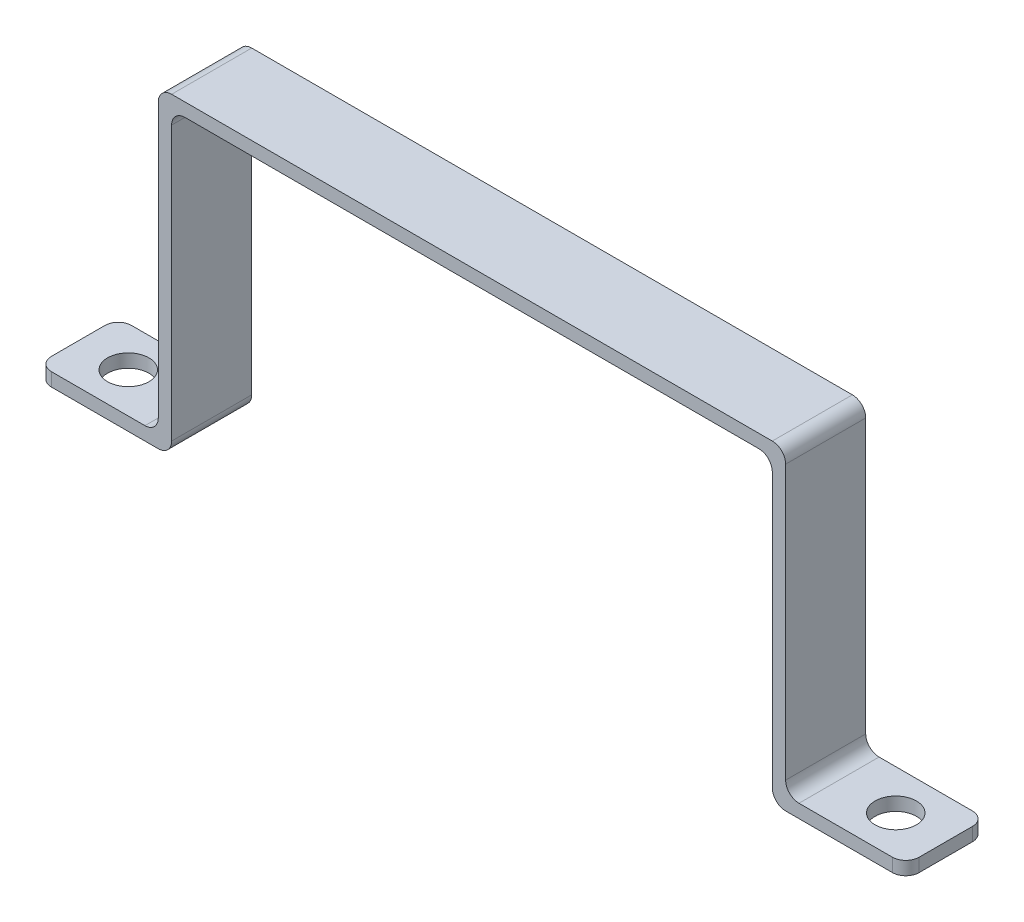
ISO-10303-21;
HEADER;
FILE_DESCRIPTION(('STEP AP214'),'2;1');
FILE_NAME('part.step','',(''),(''),'','','');
FILE_SCHEMA(('AUTOMOTIVE_DESIGN { 1 0 10303 214 1 1 1 1 }'));
ENDSEC;
DATA;
#1=APPLICATION_CONTEXT('core data for automotive mechanical design processes');
#2=APPLICATION_PROTOCOL_DEFINITION('international standard','automotive_design',2000,#1);
#3=PRODUCT_CONTEXT('',#1,'mechanical');
#4=PRODUCT('Part','Part','',(#3));
#5=PRODUCT_RELATED_PRODUCT_CATEGORY('part','',(#4));
#6=PRODUCT_DEFINITION_FORMATION('','',#4);
#7=PRODUCT_DEFINITION_CONTEXT('part definition',#1,'design');
#8=PRODUCT_DEFINITION('design','',#6,#7);
#9=PRODUCT_DEFINITION_SHAPE('','',#8);
#10=(LENGTH_UNIT() NAMED_UNIT(*) SI_UNIT(.MILLI.,.METRE.));
#11=(NAMED_UNIT(*) PLANE_ANGLE_UNIT() SI_UNIT($,.RADIAN.));
#12=(NAMED_UNIT(*) SI_UNIT($,.STERADIAN.) SOLID_ANGLE_UNIT());
#13=UNCERTAINTY_MEASURE_WITH_UNIT(LENGTH_MEASURE(1.E-05),#10,'distance_accuracy_value','');
#14=(GEOMETRIC_REPRESENTATION_CONTEXT(3) GLOBAL_UNCERTAINTY_ASSIGNED_CONTEXT((#13)) GLOBAL_UNIT_ASSIGNED_CONTEXT((#10,
#11,#12)) REPRESENTATION_CONTEXT('',''));
#15=CARTESIAN_POINT('',(0.,0.,0.));
#16=DIRECTION('',(0.,0.,1.));
#17=DIRECTION('',(1.,0.,0.));
#18=AXIS2_PLACEMENT_3D('',#15,#16,#17);
#19=CARTESIAN_POINT('',(47.,-45.,12.));
#20=DIRECTION('',(0.,-1.,0.));
#21=DIRECTION('',(0.,0.,-1.));
#22=AXIS2_PLACEMENT_3D('',#19,#20,#21);
#23=PLANE('',#22);
#24=CARTESIAN_POINT('',(57.5,-45.,5.99999999999999));
#25=DIRECTION('',(0.,1.,0.));
#26=DIRECTION('',(1.,0.,0.));
#27=AXIS2_PLACEMENT_3D('',#24,#25,#26);
#28=CIRCLE('',#27,3.1);
#29=CARTESIAN_POINT('',(60.6,-45.,5.99999999999999));
#30=VERTEX_POINT('',#29);
#31=EDGE_CURVE('E232',#30,#30,#28,.T.);
#32=ORIENTED_EDGE('',*,*,#31,.F.);
#33=EDGE_LOOP('',(#32));
#34=FACE_BOUND('',#33,.T.);
#35=DIRECTION('',(-1.,0.,0.));
#36=VECTOR('',#35,1.);
#37=CARTESIAN_POINT('',(47.,-45.,12.));
#38=LINE('',#37,#36);
#39=CARTESIAN_POINT('',(63.,-45.,12.));
#40=VERTEX_POINT('',#39);
#41=CARTESIAN_POINT('',(49.,-45.,12.));
#42=VERTEX_POINT('',#41);
#43=EDGE_CURVE('E213',#40,#42,#38,.T.);
#44=ORIENTED_EDGE('',*,*,#43,.F.);
#45=CARTESIAN_POINT('',(63.,-45.,10.));
#46=DIRECTION('',(0.,-1.,0.));
#47=DIRECTION('',(0.,0.,-1.));
#48=AXIS2_PLACEMENT_3D('',#45,#46,#47);
#49=CIRCLE('',#48,2.);
#50=CARTESIAN_POINT('',(65.,-45.,10.));
#51=VERTEX_POINT('',#50);
#52=EDGE_CURVE('E196',#40,#51,#49,.F.);
#53=ORIENTED_EDGE('',*,*,#52,.T.);
#54=DIRECTION('',(0.,0.,-1.));
#55=VECTOR('',#54,1.);
#56=CARTESIAN_POINT('',(65.,-45.,12.));
#57=LINE('',#56,#55);
#58=CARTESIAN_POINT('',(65.,-45.,2.));
#59=VERTEX_POINT('',#58);
#60=EDGE_CURVE('E256',#51,#59,#57,.T.);
#61=ORIENTED_EDGE('',*,*,#60,.T.);
#62=CARTESIAN_POINT('',(63.,-45.,2.));
#63=DIRECTION('',(0.,-1.,0.));
#64=DIRECTION('',(0.,0.,-1.));
#65=AXIS2_PLACEMENT_3D('',#62,#63,#64);
#66=CIRCLE('',#65,2.);
#67=CARTESIAN_POINT('',(63.,-45.,0.));
#68=VERTEX_POINT('',#67);
#69=EDGE_CURVE('E207',#59,#68,#66,.F.);
#70=ORIENTED_EDGE('',*,*,#69,.T.);
#71=DIRECTION('',(-1.,0.,0.));
#72=VECTOR('',#71,1.);
#73=CARTESIAN_POINT('',(47.,-45.,0.));
#74=LINE('',#73,#72);
#75=CARTESIAN_POINT('',(49.,-45.,0.));
#76=VERTEX_POINT('',#75);
#77=EDGE_CURVE('E257',#68,#76,#74,.T.);
#78=ORIENTED_EDGE('',*,*,#77,.T.);
#79=DIRECTION('',(0.,0.,-1.));
#80=VECTOR('',#79,1.);
#81=CARTESIAN_POINT('',(49.,-45.,12.));
#82=LINE('',#81,#80);
#83=EDGE_CURVE('E217',#76,#42,#82,.F.);
#84=ORIENTED_EDGE('',*,*,#83,.T.);
#85=EDGE_LOOP('',(#44,#53,#61,#70,#78,#84));
#86=FACE_BOUND('',#85,.T.);
#87=ADVANCED_FACE('F32',(#34,#86),#23,.F.);
#88=CARTESIAN_POINT('',(47.,0.,12.));
#89=DIRECTION('',(-1.,0.,0.));
#90=DIRECTION('',(0.,-1.,0.));
#91=AXIS2_PLACEMENT_3D('',#88,#89,#90);
#92=PLANE('',#91);
#93=DIRECTION('',(0.,1.,0.));
#94=VECTOR('',#93,1.);
#95=CARTESIAN_POINT('',(47.,0.,12.));
#96=LINE('',#95,#94);
#97=CARTESIAN_POINT('',(47.,-43.,12.));
#98=VERTEX_POINT('',#97);
#99=CARTESIAN_POINT('',(47.,-2.,12.));
#100=VERTEX_POINT('',#99);
#101=EDGE_CURVE('E222',#98,#100,#96,.T.);
#102=ORIENTED_EDGE('',*,*,#101,.F.);
#103=DIRECTION('',(0.,0.,-1.));
#104=VECTOR('',#103,1.);
#105=CARTESIAN_POINT('',(47.,-43.,0.));
#106=LINE('',#105,#104);
#107=CARTESIAN_POINT('',(47.,-43.,0.));
#108=VERTEX_POINT('',#107);
#109=EDGE_CURVE('E326',#98,#108,#106,.T.);
#110=ORIENTED_EDGE('',*,*,#109,.T.);
#111=DIRECTION('',(0.,1.,0.));
#112=VECTOR('',#111,1.);
#113=CARTESIAN_POINT('',(47.,0.,0.));
#114=LINE('',#113,#112);
#115=CARTESIAN_POINT('',(47.,-2.,0.));
#116=VERTEX_POINT('',#115);
#117=EDGE_CURVE('E259',#108,#116,#114,.T.);
#118=ORIENTED_EDGE('',*,*,#117,.T.);
#119=DIRECTION('',(0.,0.,-1.));
#120=VECTOR('',#119,1.);
#121=CARTESIAN_POINT('',(47.,-2.,12.));
#122=LINE('',#121,#120);
#123=EDGE_CURVE('E324',#116,#100,#122,.F.);
#124=ORIENTED_EDGE('',*,*,#123,.T.);
#125=EDGE_LOOP('',(#102,#110,#118,#124));
#126=FACE_BOUND('',#125,.T.);
#127=ADVANCED_FACE('F398',(#126),#92,.F.);
#128=CARTESIAN_POINT('',(47.,0.,12.));
#129=DIRECTION('',(0.,-1.,0.));
#130=DIRECTION('',(1.,0.,0.));
#131=AXIS2_PLACEMENT_3D('',#128,#129,#130);
#132=PLANE('',#131);
#133=DIRECTION('',(-1.,0.,0.));
#134=VECTOR('',#133,1.);
#135=CARTESIAN_POINT('',(47.,0.,0.));
#136=LINE('',#135,#134);
#137=CARTESIAN_POINT('',(45.,0.,0.));
#138=VERTEX_POINT('',#137);
#139=CARTESIAN_POINT('',(-45.,0.,0.));
#140=VERTEX_POINT('',#139);
#141=EDGE_CURVE('E262',#138,#140,#136,.T.);
#142=ORIENTED_EDGE('',*,*,#141,.T.);
#143=DIRECTION('',(0.,0.,-1.));
#144=VECTOR('',#143,1.);
#145=CARTESIAN_POINT('',(-45.,0.,12.));
#146=LINE('',#145,#144);
#147=CARTESIAN_POINT('',(-45.,0.,12.));
#148=VERTEX_POINT('',#147);
#149=EDGE_CURVE('E368',#140,#148,#146,.F.);
#150=ORIENTED_EDGE('',*,*,#149,.T.);
#151=DIRECTION('',(-1.,0.,0.));
#152=VECTOR('',#151,1.);
#153=CARTESIAN_POINT('',(47.,0.,12.));
#154=LINE('',#153,#152);
#155=CARTESIAN_POINT('',(45.,0.,12.));
#156=VERTEX_POINT('',#155);
#157=EDGE_CURVE('E226',#156,#148,#154,.T.);
#158=ORIENTED_EDGE('',*,*,#157,.F.);
#159=DIRECTION('',(0.,0.,-1.));
#160=VECTOR('',#159,1.);
#161=CARTESIAN_POINT('',(45.,0.,12.));
#162=LINE('',#161,#160);
#163=EDGE_CURVE('E365',#156,#138,#162,.T.);
#164=ORIENTED_EDGE('',*,*,#163,.T.);
#165=EDGE_LOOP('',(#142,#150,#158,#164));
#166=FACE_BOUND('',#165,.T.);
#167=ADVANCED_FACE('F403',(#166),#132,.F.);
#168=CARTESIAN_POINT('',(-47.,0.,12.));
#169=DIRECTION('',(1.,0.,0.));
#170=DIRECTION('',(0.,1.,0.));
#171=AXIS2_PLACEMENT_3D('',#168,#169,#170);
#172=PLANE('',#171);
#173=DIRECTION('',(0.,-1.,0.));
#174=VECTOR('',#173,1.);
#175=CARTESIAN_POINT('',(-47.,0.,0.));
#176=LINE('',#175,#174);
#177=CARTESIAN_POINT('',(-47.,-2.00000000000001,0.));
#178=VERTEX_POINT('',#177);
#179=CARTESIAN_POINT('',(-47.,-43.,0.));
#180=VERTEX_POINT('',#179);
#181=EDGE_CURVE('E265',#178,#180,#176,.T.);
#182=ORIENTED_EDGE('',*,*,#181,.T.);
#183=DIRECTION('',(0.,0.,-1.));
#184=VECTOR('',#183,1.);
#185=CARTESIAN_POINT('',(-47.,-43.,12.));
#186=LINE('',#185,#184);
#187=CARTESIAN_POINT('',(-47.,-43.,12.));
#188=VERTEX_POINT('',#187);
#189=EDGE_CURVE('E363',#180,#188,#186,.F.);
#190=ORIENTED_EDGE('',*,*,#189,.T.);
#191=DIRECTION('',(0.,-1.,0.));
#192=VECTOR('',#191,1.);
#193=CARTESIAN_POINT('',(-47.,0.,12.));
#194=LINE('',#193,#192);
#195=CARTESIAN_POINT('',(-47.,-2.00000000000001,12.));
#196=VERTEX_POINT('',#195);
#197=EDGE_CURVE('E237',#196,#188,#194,.T.);
#198=ORIENTED_EDGE('',*,*,#197,.F.);
#199=DIRECTION('',(0.,0.,-1.));
#200=VECTOR('',#199,1.);
#201=CARTESIAN_POINT('',(-47.,-2.00000000000001,12.));
#202=LINE('',#201,#200);
#203=EDGE_CURVE('E360',#196,#178,#202,.T.);
#204=ORIENTED_EDGE('',*,*,#203,.T.);
#205=EDGE_LOOP('',(#182,#190,#198,#204));
#206=FACE_BOUND('',#205,.T.);
#207=ADVANCED_FACE('F460',(#206),#172,.F.);
#208=CARTESIAN_POINT('',(-47.,-45.,12.));
#209=DIRECTION('',(0.,-1.,0.));
#210=DIRECTION('',(0.,0.,-1.));
#211=AXIS2_PLACEMENT_3D('',#208,#209,#210);
#212=PLANE('',#211);
#213=CARTESIAN_POINT('',(-57.5,-45.,6.));
#214=DIRECTION('',(0.,1.,0.));
#215=DIRECTION('',(-1.,0.,0.));
#216=AXIS2_PLACEMENT_3D('',#213,#214,#215);
#217=CIRCLE('',#216,3.1);
#218=CARTESIAN_POINT('',(-60.6,-45.,6.));
#219=VERTEX_POINT('',#218);
#220=EDGE_CURVE('E384',#219,#219,#217,.T.);
#221=ORIENTED_EDGE('',*,*,#220,.F.);
#222=EDGE_LOOP('',(#221));
#223=FACE_BOUND('',#222,.T.);
#224=DIRECTION('',(-1.,0.,0.));
#225=VECTOR('',#224,1.);
#226=CARTESIAN_POINT('',(-47.,-45.,0.));
#227=LINE('',#226,#225);
#228=CARTESIAN_POINT('',(-49.,-45.,0.));
#229=VERTEX_POINT('',#228);
#230=CARTESIAN_POINT('',(-63.,-45.,0.));
#231=VERTEX_POINT('',#230);
#232=EDGE_CURVE('E268',#229,#231,#227,.T.);
#233=ORIENTED_EDGE('',*,*,#232,.T.);
#234=CARTESIAN_POINT('',(-63.,-45.,2.));
#235=DIRECTION('',(0.,-1.,0.));
#236=DIRECTION('',(0.,0.,-1.));
#237=AXIS2_PLACEMENT_3D('',#234,#235,#236);
#238=CIRCLE('',#237,2.);
#239=CARTESIAN_POINT('',(-65.,-45.,2.));
#240=VERTEX_POINT('',#239);
#241=EDGE_CURVE('E49',#231,#240,#238,.F.);
#242=ORIENTED_EDGE('',*,*,#241,.T.);
#243=DIRECTION('',(0.,0.,-1.));
#244=VECTOR('',#243,1.);
#245=CARTESIAN_POINT('',(-65.,-45.,12.));
#246=LINE('',#245,#244);
#247=CARTESIAN_POINT('',(-65.,-45.,10.));
#248=VERTEX_POINT('',#247);
#249=EDGE_CURVE('E288',#248,#240,#246,.T.);
#250=ORIENTED_EDGE('',*,*,#249,.F.);
#251=CARTESIAN_POINT('',(-63.,-45.,10.));
#252=DIRECTION('',(0.,-1.,0.));
#253=DIRECTION('',(0.,0.,-1.));
#254=AXIS2_PLACEMENT_3D('',#251,#252,#253);
#255=CIRCLE('',#254,2.);
#256=CARTESIAN_POINT('',(-63.,-45.,12.));
#257=VERTEX_POINT('',#256);
#258=EDGE_CURVE('E357',#248,#257,#255,.F.);
#259=ORIENTED_EDGE('',*,*,#258,.T.);
#260=DIRECTION('',(-1.,0.,0.));
#261=VECTOR('',#260,1.);
#262=CARTESIAN_POINT('',(-47.,-45.,12.));
#263=LINE('',#262,#261);
#264=CARTESIAN_POINT('',(-49.,-45.,12.));
#265=VERTEX_POINT('',#264);
#266=EDGE_CURVE('E240',#265,#257,#263,.T.);
#267=ORIENTED_EDGE('',*,*,#266,.F.);
#268=DIRECTION('',(0.,0.,-1.));
#269=VECTOR('',#268,1.);
#270=CARTESIAN_POINT('',(-49.,-45.,0.));
#271=LINE('',#270,#269);
#272=EDGE_CURVE('E354',#265,#229,#271,.T.);
#273=ORIENTED_EDGE('',*,*,#272,.T.);
#274=EDGE_LOOP('',(#233,#242,#250,#259,#267,#273));
#275=FACE_BOUND('',#274,.T.);
#276=ADVANCED_FACE('F466',(#223,#275),#212,.F.);
#277=CARTESIAN_POINT('',(-65.,-45.,12.));
#278=DIRECTION('',(1.,0.,0.));
#279=DIRECTION('',(0.,0.,-1.));
#280=AXIS2_PLACEMENT_3D('',#277,#278,#279);
#281=PLANE('',#280);
#282=ORIENTED_EDGE('',*,*,#249,.T.);
#283=DIRECTION('',(0.,-1.,0.));
#284=VECTOR('',#283,1.);
#285=CARTESIAN_POINT('',(-65.,-47.,2.));
#286=LINE('',#285,#284);
#287=CARTESIAN_POINT('',(-65.,-47.,2.));
#288=VERTEX_POINT('',#287);
#289=EDGE_CURVE('E351',#240,#288,#286,.T.);
#290=ORIENTED_EDGE('',*,*,#289,.T.);
#291=DIRECTION('',(0.,0.,-1.));
#292=VECTOR('',#291,1.);
#293=CARTESIAN_POINT('',(-65.,-47.,12.));
#294=LINE('',#293,#292);
#295=CARTESIAN_POINT('',(-65.,-47.,10.));
#296=VERTEX_POINT('',#295);
#297=EDGE_CURVE('E285',#296,#288,#294,.T.);
#298=ORIENTED_EDGE('',*,*,#297,.F.);
#299=DIRECTION('',(0.,-1.,0.));
#300=VECTOR('',#299,1.);
#301=CARTESIAN_POINT('',(-65.,-45.,10.));
#302=LINE('',#301,#300);
#303=EDGE_CURVE('E56',#296,#248,#302,.F.);
#304=ORIENTED_EDGE('',*,*,#303,.T.);
#305=EDGE_LOOP('',(#282,#290,#298,#304));
#306=FACE_BOUND('',#305,.T.);
#307=ADVANCED_FACE('F518',(#306),#281,.F.);
#308=CARTESIAN_POINT('',(-45.,-47.,12.));
#309=DIRECTION('',(0.,1.,0.));
#310=DIRECTION('',(-1.,0.,0.));
#311=AXIS2_PLACEMENT_3D('',#308,#309,#310);
#312=PLANE('',#311);
#313=CARTESIAN_POINT('',(-57.5,-47.,6.));
#314=DIRECTION('',(0.,1.,0.));
#315=DIRECTION('',(-1.,0.,0.));
#316=AXIS2_PLACEMENT_3D('',#313,#314,#315);
#317=CIRCLE('',#316,3.1);
#318=CARTESIAN_POINT('',(-60.6,-47.,6.));
#319=VERTEX_POINT('',#318);
#320=EDGE_CURVE('E36',#319,#319,#317,.T.);
#321=ORIENTED_EDGE('',*,*,#320,.T.);
#322=EDGE_LOOP('',(#321));
#323=FACE_BOUND('',#322,.T.);
#324=DIRECTION('',(1.,0.,0.));
#325=VECTOR('',#324,1.);
#326=CARTESIAN_POINT('',(-45.,-47.,0.));
#327=LINE('',#326,#325);
#328=CARTESIAN_POINT('',(-63.,-47.,0.));
#329=VERTEX_POINT('',#328);
#330=CARTESIAN_POINT('',(-47.,-47.,0.));
#331=VERTEX_POINT('',#330);
#332=EDGE_CURVE('E270',#329,#331,#327,.T.);
#333=ORIENTED_EDGE('',*,*,#332,.T.);
#334=DIRECTION('',(0.,0.,-1.));
#335=VECTOR('',#334,1.);
#336=CARTESIAN_POINT('',(-47.,-47.,12.));
#337=LINE('',#336,#335);
#338=CARTESIAN_POINT('',(-47.,-47.,12.));
#339=VERTEX_POINT('',#338);
#340=EDGE_CURVE('E343',#331,#339,#337,.F.);
#341=ORIENTED_EDGE('',*,*,#340,.T.);
#342=DIRECTION('',(1.,0.,0.));
#343=VECTOR('',#342,1.);
#344=CARTESIAN_POINT('',(-45.,-47.,12.));
#345=LINE('',#344,#343);
#346=CARTESIAN_POINT('',(-63.,-47.,12.));
#347=VERTEX_POINT('',#346);
#348=EDGE_CURVE('E243',#347,#339,#345,.T.);
#349=ORIENTED_EDGE('',*,*,#348,.F.);
#350=CARTESIAN_POINT('',(-63.,-47.,10.));
#351=DIRECTION('',(0.,1.,0.));
#352=DIRECTION('',(-1.,0.,0.));
#353=AXIS2_PLACEMENT_3D('',#350,#351,#352);
#354=CIRCLE('',#353,2.);
#355=EDGE_CURVE('E339',#347,#296,#354,.F.);
#356=ORIENTED_EDGE('',*,*,#355,.T.);
#357=ORIENTED_EDGE('',*,*,#297,.T.);
#358=CARTESIAN_POINT('',(-63.,-47.,2.));
#359=DIRECTION('',(0.,1.,0.));
#360=DIRECTION('',(-1.,0.,0.));
#361=AXIS2_PLACEMENT_3D('',#358,#359,#360);
#362=CIRCLE('',#361,2.);
#363=EDGE_CURVE('E341',#288,#329,#362,.F.);
#364=ORIENTED_EDGE('',*,*,#363,.T.);
#365=EDGE_LOOP('',(#333,#341,#349,#356,#357,#364));
#366=FACE_BOUND('',#365,.T.);
#367=ADVANCED_FACE('F472',(#323,#366),#312,.F.);
#368=CARTESIAN_POINT('',(-45.,-47.,12.));
#369=DIRECTION('',(-1.,0.,0.));
#370=DIRECTION('',(0.,-1.,0.));
#371=AXIS2_PLACEMENT_3D('',#368,#369,#370);
#372=PLANE('',#371);
#373=DIRECTION('',(0.,1.,0.));
#374=VECTOR('',#373,1.);
#375=CARTESIAN_POINT('',(-45.,-47.,12.));
#376=LINE('',#375,#374);
#377=CARTESIAN_POINT('',(-45.,-45.,12.));
#378=VERTEX_POINT('',#377);
#379=CARTESIAN_POINT('',(-45.,-4.00000000000002,12.));
#380=VERTEX_POINT('',#379);
#381=EDGE_CURVE('E246',#378,#380,#376,.T.);
#382=ORIENTED_EDGE('',*,*,#381,.F.);
#383=DIRECTION('',(0.,0.,-1.));
#384=VECTOR('',#383,1.);
#385=CARTESIAN_POINT('',(-45.,-45.,12.));
#386=LINE('',#385,#384);
#387=CARTESIAN_POINT('',(-45.,-45.,0.));
#388=VERTEX_POINT('',#387);
#389=EDGE_CURVE('E336',#378,#388,#386,.T.);
#390=ORIENTED_EDGE('',*,*,#389,.T.);
#391=DIRECTION('',(0.,1.,0.));
#392=VECTOR('',#391,1.);
#393=CARTESIAN_POINT('',(-45.,-47.,0.));
#394=LINE('',#393,#392);
#395=CARTESIAN_POINT('',(-45.,-4.00000000000002,0.));
#396=VERTEX_POINT('',#395);
#397=EDGE_CURVE('E273',#388,#396,#394,.T.);
#398=ORIENTED_EDGE('',*,*,#397,.T.);
#399=DIRECTION('',(0.,0.,-1.));
#400=VECTOR('',#399,1.);
#401=CARTESIAN_POINT('',(-45.,-4.00000000000001,12.));
#402=LINE('',#401,#400);
#403=EDGE_CURVE('E334',#396,#380,#402,.F.);
#404=ORIENTED_EDGE('',*,*,#403,.T.);
#405=EDGE_LOOP('',(#382,#390,#398,#404));
#406=FACE_BOUND('',#405,.T.);
#407=ADVANCED_FACE('F479',(#406),#372,.F.);
#408=CARTESIAN_POINT('',(-45.,-2.00000000000001,12.));
#409=DIRECTION('',(0.,1.,0.));
#410=DIRECTION('',(-1.,0.,0.));
#411=AXIS2_PLACEMENT_3D('',#408,#409,#410);
#412=PLANE('',#411);
#413=DIRECTION('',(1.,0.,0.));
#414=VECTOR('',#413,1.);
#415=CARTESIAN_POINT('',(-45.,-2.00000000000001,12.));
#416=LINE('',#415,#414);
#417=CARTESIAN_POINT('',(-43.,-2.00000000000001,12.));
#418=VERTEX_POINT('',#417);
#419=CARTESIAN_POINT('',(43.,-2.,12.));
#420=VERTEX_POINT('',#419);
#421=EDGE_CURVE('E249',#418,#420,#416,.T.);
#422=ORIENTED_EDGE('',*,*,#421,.F.);
#423=DIRECTION('',(0.,0.,-1.));
#424=VECTOR('',#423,1.);
#425=CARTESIAN_POINT('',(-43.,-2.00000000000001,0.));
#426=LINE('',#425,#424);
#427=CARTESIAN_POINT('',(-43.,-2.00000000000001,0.));
#428=VERTEX_POINT('',#427);
#429=EDGE_CURVE('E347',#418,#428,#426,.T.);
#430=ORIENTED_EDGE('',*,*,#429,.T.);
#431=DIRECTION('',(1.,0.,0.));
#432=VECTOR('',#431,1.);
#433=CARTESIAN_POINT('',(-45.,-2.00000000000001,0.));
#434=LINE('',#433,#432);
#435=CARTESIAN_POINT('',(43.,-2.,0.));
#436=VERTEX_POINT('',#435);
#437=EDGE_CURVE('E276',#428,#436,#434,.T.);
#438=ORIENTED_EDGE('',*,*,#437,.T.);
#439=DIRECTION('',(0.,0.,-1.));
#440=VECTOR('',#439,1.);
#441=CARTESIAN_POINT('',(43.,-2.,12.));
#442=LINE('',#441,#440);
#443=EDGE_CURVE('E345',#436,#420,#442,.F.);
#444=ORIENTED_EDGE('',*,*,#443,.T.);
#445=EDGE_LOOP('',(#422,#430,#438,#444));
#446=FACE_BOUND('',#445,.T.);
#447=ADVANCED_FACE('F486',(#446),#412,.F.);
#448=CARTESIAN_POINT('',(45.,-47.,12.));
#449=DIRECTION('',(1.,0.,0.));
#450=DIRECTION('',(0.,1.,0.));
#451=AXIS2_PLACEMENT_3D('',#448,#449,#450);
#452=PLANE('',#451);
#453=DIRECTION('',(0.,-1.,0.));
#454=VECTOR('',#453,1.);
#455=CARTESIAN_POINT('',(45.,-47.,0.));
#456=LINE('',#455,#454);
#457=CARTESIAN_POINT('',(45.,-4.00000000000001,0.));
#458=VERTEX_POINT('',#457);
#459=CARTESIAN_POINT('',(45.,-45.,0.));
#460=VERTEX_POINT('',#459);
#461=EDGE_CURVE('E229',#458,#460,#456,.T.);
#462=ORIENTED_EDGE('',*,*,#461,.T.);
#463=DIRECTION('',(0.,0.,-1.));
#464=VECTOR('',#463,1.);
#465=CARTESIAN_POINT('',(45.,-45.,12.));
#466=LINE('',#465,#464);
#467=CARTESIAN_POINT('',(45.,-45.,12.));
#468=VERTEX_POINT('',#467);
#469=EDGE_CURVE('E332',#460,#468,#466,.F.);
#470=ORIENTED_EDGE('',*,*,#469,.T.);
#471=DIRECTION('',(0.,-1.,0.));
#472=VECTOR('',#471,1.);
#473=CARTESIAN_POINT('',(45.,-47.,12.));
#474=LINE('',#473,#472);
#475=CARTESIAN_POINT('',(45.,-4.00000000000001,12.));
#476=VERTEX_POINT('',#475);
#477=EDGE_CURVE('E252',#476,#468,#474,.T.);
#478=ORIENTED_EDGE('',*,*,#477,.F.);
#479=DIRECTION('',(0.,0.,-1.));
#480=VECTOR('',#479,1.);
#481=CARTESIAN_POINT('',(45.,-4.,0.));
#482=LINE('',#481,#480);
#483=EDGE_CURVE('E329',#476,#458,#482,.T.);
#484=ORIENTED_EDGE('',*,*,#483,.T.);
#485=EDGE_LOOP('',(#462,#470,#478,#484));
#486=FACE_BOUND('',#485,.T.);
#487=ADVANCED_FACE('F493',(#486),#452,.F.);
#488=CARTESIAN_POINT('',(45.,-47.,12.));
#489=DIRECTION('',(0.,1.,0.));
#490=DIRECTION('',(-1.,0.,0.));
#491=AXIS2_PLACEMENT_3D('',#488,#489,#490);
#492=PLANE('',#491);
#493=CARTESIAN_POINT('',(57.5,-47.,5.99999999999999));
#494=DIRECTION('',(0.,1.,0.));
#495=DIRECTION('',(-1.,0.,0.));
#496=AXIS2_PLACEMENT_3D('',#493,#494,#495);
#497=CIRCLE('',#496,3.1);
#498=CARTESIAN_POINT('',(54.4,-47.,5.99999999999999));
#499=VERTEX_POINT('',#498);
#500=EDGE_CURVE('E382',#499,#499,#497,.T.);
#501=ORIENTED_EDGE('',*,*,#500,.T.);
#502=EDGE_LOOP('',(#501));
#503=FACE_BOUND('',#502,.T.);
#504=DIRECTION('',(0.,0.,-1.));
#505=VECTOR('',#504,1.);
#506=CARTESIAN_POINT('',(65.,-47.,12.));
#507=LINE('',#506,#505);
#508=CARTESIAN_POINT('',(65.,-47.,10.));
#509=VERTEX_POINT('',#508);
#510=CARTESIAN_POINT('',(65.,-47.,2.));
#511=VERTEX_POINT('',#510);
#512=EDGE_CURVE('E282',#509,#511,#507,.T.);
#513=ORIENTED_EDGE('',*,*,#512,.F.);
#514=CARTESIAN_POINT('',(63.,-47.,10.));
#515=DIRECTION('',(0.,1.,0.));
#516=DIRECTION('',(-1.,0.,0.));
#517=AXIS2_PLACEMENT_3D('',#514,#515,#516);
#518=CIRCLE('',#517,2.);
#519=CARTESIAN_POINT('',(63.,-47.,12.));
#520=VERTEX_POINT('',#519);
#521=EDGE_CURVE('E310',#509,#520,#518,.F.);
#522=ORIENTED_EDGE('',*,*,#521,.T.);
#523=DIRECTION('',(1.,0.,0.));
#524=VECTOR('',#523,1.);
#525=CARTESIAN_POINT('',(45.,-47.,12.));
#526=LINE('',#525,#524);
#527=CARTESIAN_POINT('',(47.,-47.,12.));
#528=VERTEX_POINT('',#527);
#529=EDGE_CURVE('E216',#528,#520,#526,.T.);
#530=ORIENTED_EDGE('',*,*,#529,.F.);
#531=DIRECTION('',(0.,0.,-1.));
#532=VECTOR('',#531,1.);
#533=CARTESIAN_POINT('',(47.,-47.,12.));
#534=LINE('',#533,#532);
#535=CARTESIAN_POINT('',(47.,-47.,0.));
#536=VERTEX_POINT('',#535);
#537=EDGE_CURVE('E305',#528,#536,#534,.T.);
#538=ORIENTED_EDGE('',*,*,#537,.T.);
#539=DIRECTION('',(1.,0.,0.));
#540=VECTOR('',#539,1.);
#541=CARTESIAN_POINT('',(45.,-47.,0.));
#542=LINE('',#541,#540);
#543=CARTESIAN_POINT('',(63.,-47.,0.));
#544=VERTEX_POINT('',#543);
#545=EDGE_CURVE('E223',#536,#544,#542,.T.);
#546=ORIENTED_EDGE('',*,*,#545,.T.);
#547=CARTESIAN_POINT('',(63.,-47.,2.));
#548=DIRECTION('',(0.,1.,0.));
#549=DIRECTION('',(-1.,0.,0.));
#550=AXIS2_PLACEMENT_3D('',#547,#548,#549);
#551=CIRCLE('',#550,2.);
#552=EDGE_CURVE('E308',#544,#511,#551,.F.);
#553=ORIENTED_EDGE('',*,*,#552,.T.);
#554=EDGE_LOOP('',(#513,#522,#530,#538,#546,#553));
#555=FACE_BOUND('',#554,.T.);
#556=ADVANCED_FACE('F499',(#503,#555),#492,.F.);
#557=CARTESIAN_POINT('',(65.,-45.,12.));
#558=DIRECTION('',(-1.,0.,0.));
#559=DIRECTION('',(0.,0.,1.));
#560=AXIS2_PLACEMENT_3D('',#557,#558,#559);
#561=PLANE('',#560);
#562=ORIENTED_EDGE('',*,*,#60,.F.);
#563=DIRECTION('',(0.,1.,0.));
#564=VECTOR('',#563,1.);
#565=CARTESIAN_POINT('',(65.,-45.,10.));
#566=LINE('',#565,#564);
#567=EDGE_CURVE('E201',#51,#509,#566,.F.);
#568=ORIENTED_EDGE('',*,*,#567,.T.);
#569=ORIENTED_EDGE('',*,*,#512,.T.);
#570=DIRECTION('',(0.,1.,0.));
#571=VECTOR('',#570,1.);
#572=CARTESIAN_POINT('',(65.,-45.,2.));
#573=LINE('',#572,#571);
#574=EDGE_CURVE('E206',#511,#59,#573,.T.);
#575=ORIENTED_EDGE('',*,*,#574,.T.);
#576=EDGE_LOOP('',(#562,#568,#569,#575));
#577=FACE_BOUND('',#576,.T.);
#578=ADVANCED_FACE('F504',(#577),#561,.F.);
#579=CARTESIAN_POINT('',(0.,0.,12.));
#580=DIRECTION('',(0.,0.,-1.));
#581=DIRECTION('',(-1.,0.,0.));
#582=AXIS2_PLACEMENT_3D('',#579,#580,#581);
#583=PLANE('',#582);
#584=ORIENTED_EDGE('',*,*,#529,.T.);
#585=DIRECTION('',(0.,1.,0.));
#586=VECTOR('',#585,1.);
#587=CARTESIAN_POINT('',(63.,0.,12.));
#588=LINE('',#587,#586);
#589=EDGE_CURVE('E200',#520,#40,#588,.T.);
#590=ORIENTED_EDGE('',*,*,#589,.T.);
#591=ORIENTED_EDGE('',*,*,#43,.T.);
#592=CARTESIAN_POINT('',(49.,-43.,12.));
#593=DIRECTION('',(0.,0.,-1.));
#594=DIRECTION('',(-1.,0.,0.));
#595=AXIS2_PLACEMENT_3D('',#592,#593,#594);
#596=CIRCLE('',#595,2.);
#597=EDGE_CURVE('E372',#42,#98,#596,.T.);
#598=ORIENTED_EDGE('',*,*,#597,.T.);
#599=ORIENTED_EDGE('',*,*,#101,.T.);
#600=CARTESIAN_POINT('',(45.,-2.,12.));
#601=DIRECTION('',(0.,0.,-1.));
#602=DIRECTION('',(-1.,0.,0.));
#603=AXIS2_PLACEMENT_3D('',#600,#601,#602);
#604=CIRCLE('',#603,2.);
#605=EDGE_CURVE('E290',#100,#156,#604,.F.);
#606=ORIENTED_EDGE('',*,*,#605,.T.);
#607=ORIENTED_EDGE('',*,*,#157,.T.);
#608=CARTESIAN_POINT('',(-45.,-2.00000000000001,12.));
#609=DIRECTION('',(0.,0.,-1.));
#610=DIRECTION('',(-1.,0.,0.));
#611=AXIS2_PLACEMENT_3D('',#608,#609,#610);
#612=CIRCLE('',#611,2.);
#613=EDGE_CURVE('E292',#148,#196,#612,.F.);
#614=ORIENTED_EDGE('',*,*,#613,.T.);
#615=ORIENTED_EDGE('',*,*,#197,.T.);
#616=CARTESIAN_POINT('',(-49.,-43.,12.));
#617=DIRECTION('',(0.,0.,-1.));
#618=DIRECTION('',(-1.,0.,0.));
#619=AXIS2_PLACEMENT_3D('',#616,#617,#618);
#620=CIRCLE('',#619,2.);
#621=EDGE_CURVE('E11',#188,#265,#620,.T.);
#622=ORIENTED_EDGE('',*,*,#621,.T.);
#623=ORIENTED_EDGE('',*,*,#266,.T.);
#624=DIRECTION('',(0.,-1.,0.));
#625=VECTOR('',#624,1.);
#626=CARTESIAN_POINT('',(-63.,0.,12.));
#627=LINE('',#626,#625);
#628=EDGE_CURVE('E294',#257,#347,#627,.T.);
#629=ORIENTED_EDGE('',*,*,#628,.T.);
#630=ORIENTED_EDGE('',*,*,#348,.T.);
#631=CARTESIAN_POINT('',(-47.,-45.,12.));
#632=DIRECTION('',(0.,0.,-1.));
#633=DIRECTION('',(-1.,0.,0.));
#634=AXIS2_PLACEMENT_3D('',#631,#632,#633);
#635=CIRCLE('',#634,2.);
#636=EDGE_CURVE('E297',#339,#378,#635,.F.);
#637=ORIENTED_EDGE('',*,*,#636,.T.);
#638=ORIENTED_EDGE('',*,*,#381,.T.);
#639=CARTESIAN_POINT('',(-43.,-4.00000000000001,12.));
#640=DIRECTION('',(0.,0.,-1.));
#641=DIRECTION('',(-1.,0.,0.));
#642=AXIS2_PLACEMENT_3D('',#639,#640,#641);
#643=CIRCLE('',#642,2.);
#644=EDGE_CURVE('E376',#380,#418,#643,.T.);
#645=ORIENTED_EDGE('',*,*,#644,.T.);
#646=ORIENTED_EDGE('',*,*,#421,.T.);
#647=CARTESIAN_POINT('',(43.,-4.,12.));
#648=DIRECTION('',(0.,0.,-1.));
#649=DIRECTION('',(-1.,0.,0.));
#650=AXIS2_PLACEMENT_3D('',#647,#648,#649);
#651=CIRCLE('',#650,2.);
#652=EDGE_CURVE('E380',#420,#476,#651,.T.);
#653=ORIENTED_EDGE('',*,*,#652,.T.);
#654=ORIENTED_EDGE('',*,*,#477,.T.);
#655=CARTESIAN_POINT('',(47.,-45.,12.));
#656=DIRECTION('',(0.,0.,-1.));
#657=DIRECTION('',(-1.,0.,0.));
#658=AXIS2_PLACEMENT_3D('',#655,#656,#657);
#659=CIRCLE('',#658,2.);
#660=EDGE_CURVE('E218',#468,#528,#659,.F.);
#661=ORIENTED_EDGE('',*,*,#660,.T.);
#662=EDGE_LOOP('',(#584,#590,#591,#598,#599,#606,#607,#614,#615,#622,#623,#629,#630,#637,#638,
#645,#646,#653,#654,#661));
#663=FACE_BOUND('',#662,.T.);
#664=ADVANCED_FACE('F212',(#663),#583,.F.);
#665=CARTESIAN_POINT('',(0.,0.,0.));
#666=DIRECTION('',(0.,0.,-1.));
#667=DIRECTION('',(-1.,0.,0.));
#668=AXIS2_PLACEMENT_3D('',#665,#666,#667);
#669=PLANE('',#668);
#670=ORIENTED_EDGE('',*,*,#77,.F.);
#671=DIRECTION('',(0.,1.,0.));
#672=VECTOR('',#671,1.);
#673=CARTESIAN_POINT('',(63.,-47.,0.));
#674=LINE('',#673,#672);
#675=EDGE_CURVE('E322',#68,#544,#674,.F.);
#676=ORIENTED_EDGE('',*,*,#675,.T.);
#677=ORIENTED_EDGE('',*,*,#545,.F.);
#678=CARTESIAN_POINT('',(47.,-45.,0.));
#679=DIRECTION('',(0.,0.,-1.));
#680=DIRECTION('',(-1.,0.,0.));
#681=AXIS2_PLACEMENT_3D('',#678,#679,#680);
#682=CIRCLE('',#681,2.);
#683=EDGE_CURVE('E320',#536,#460,#682,.T.);
#684=ORIENTED_EDGE('',*,*,#683,.T.);
#685=ORIENTED_EDGE('',*,*,#461,.F.);
#686=CARTESIAN_POINT('',(43.,-4.,0.));
#687=DIRECTION('',(0.,0.,-1.));
#688=DIRECTION('',(-1.,0.,0.));
#689=AXIS2_PLACEMENT_3D('',#686,#687,#688);
#690=CIRCLE('',#689,2.);
#691=EDGE_CURVE('E378',#458,#436,#690,.F.);
#692=ORIENTED_EDGE('',*,*,#691,.T.);
#693=ORIENTED_EDGE('',*,*,#437,.F.);
#694=CARTESIAN_POINT('',(-43.,-4.00000000000001,0.));
#695=DIRECTION('',(0.,0.,-1.));
#696=DIRECTION('',(-1.,0.,0.));
#697=AXIS2_PLACEMENT_3D('',#694,#695,#696);
#698=CIRCLE('',#697,2.);
#699=EDGE_CURVE('E374',#428,#396,#698,.F.);
#700=ORIENTED_EDGE('',*,*,#699,.T.);
#701=ORIENTED_EDGE('',*,*,#397,.F.);
#702=CARTESIAN_POINT('',(-47.,-45.,0.));
#703=DIRECTION('',(0.,0.,-1.));
#704=DIRECTION('',(-1.,0.,0.));
#705=AXIS2_PLACEMENT_3D('',#702,#703,#704);
#706=CIRCLE('',#705,2.);
#707=EDGE_CURVE('E318',#388,#331,#706,.T.);
#708=ORIENTED_EDGE('',*,*,#707,.T.);
#709=ORIENTED_EDGE('',*,*,#332,.F.);
#710=DIRECTION('',(0.,-1.,0.));
#711=VECTOR('',#710,1.);
#712=CARTESIAN_POINT('',(-63.,-45.,0.));
#713=LINE('',#712,#711);
#714=EDGE_CURVE('E316',#329,#231,#713,.F.);
#715=ORIENTED_EDGE('',*,*,#714,.T.);
#716=ORIENTED_EDGE('',*,*,#232,.F.);
#717=CARTESIAN_POINT('',(-49.,-43.,0.));
#718=DIRECTION('',(0.,0.,-1.));
#719=DIRECTION('',(-1.,0.,0.));
#720=AXIS2_PLACEMENT_3D('',#717,#718,#719);
#721=CIRCLE('',#720,2.);
#722=EDGE_CURVE('E41',#229,#180,#721,.F.);
#723=ORIENTED_EDGE('',*,*,#722,.T.);
#724=ORIENTED_EDGE('',*,*,#181,.F.);
#725=CARTESIAN_POINT('',(-45.,-2.00000000000001,0.));
#726=DIRECTION('',(0.,0.,-1.));
#727=DIRECTION('',(-1.,0.,0.));
#728=AXIS2_PLACEMENT_3D('',#725,#726,#727);
#729=CIRCLE('',#728,2.);
#730=EDGE_CURVE('E314',#178,#140,#729,.T.);
#731=ORIENTED_EDGE('',*,*,#730,.T.);
#732=ORIENTED_EDGE('',*,*,#141,.F.);
#733=CARTESIAN_POINT('',(45.,-2.,0.));
#734=DIRECTION('',(0.,0.,-1.));
#735=DIRECTION('',(-1.,0.,0.));
#736=AXIS2_PLACEMENT_3D('',#733,#734,#735);
#737=CIRCLE('',#736,2.);
#738=EDGE_CURVE('E312',#138,#116,#737,.T.);
#739=ORIENTED_EDGE('',*,*,#738,.T.);
#740=ORIENTED_EDGE('',*,*,#117,.F.);
#741=CARTESIAN_POINT('',(49.,-43.,0.));
#742=DIRECTION('',(0.,0.,-1.));
#743=DIRECTION('',(-1.,0.,0.));
#744=AXIS2_PLACEMENT_3D('',#741,#742,#743);
#745=CIRCLE('',#744,2.);
#746=EDGE_CURVE('E370',#108,#76,#745,.F.);
#747=ORIENTED_EDGE('',*,*,#746,.T.);
#748=EDGE_LOOP('',(#670,#676,#677,#684,#685,#692,#693,#700,#701,#708,#709,#715,#716,#723,#724,
#731,#732,#739,#740,#747));
#749=FACE_BOUND('',#748,.T.);
#750=ADVANCED_FACE('F411',(#749),#669,.T.);
#751=CARTESIAN_POINT('',(63.,0.,10.));
#752=DIRECTION('',(0.,1.,0.));
#753=DIRECTION('',(0.,0.,1.));
#754=AXIS2_PLACEMENT_3D('',#751,#752,#753);
#755=CYLINDRICAL_SURFACE('',#754,2.);
#756=ORIENTED_EDGE('',*,*,#521,.F.);
#757=ORIENTED_EDGE('',*,*,#567,.F.);
#758=ORIENTED_EDGE('',*,*,#52,.F.);
#759=ORIENTED_EDGE('',*,*,#589,.F.);
#760=EDGE_LOOP('',(#756,#757,#758,#759));
#761=FACE_BOUND('',#760,.T.);
#762=ADVANCED_FACE('F199',(#761),#755,.T.);
#763=CARTESIAN_POINT('',(63.,-45.,2.));
#764=DIRECTION('',(0.,-1.,0.));
#765=DIRECTION('',(0.,0.,-1.));
#766=AXIS2_PLACEMENT_3D('',#763,#764,#765);
#767=CYLINDRICAL_SURFACE('',#766,2.);
#768=ORIENTED_EDGE('',*,*,#552,.F.);
#769=ORIENTED_EDGE('',*,*,#675,.F.);
#770=ORIENTED_EDGE('',*,*,#69,.F.);
#771=ORIENTED_EDGE('',*,*,#574,.F.);
#772=EDGE_LOOP('',(#768,#769,#770,#771));
#773=FACE_BOUND('',#772,.T.);
#774=ADVANCED_FACE('F410',(#773),#767,.T.);
#775=CARTESIAN_POINT('',(49.,-43.,12.));
#776=DIRECTION('',(0.,0.,1.));
#777=DIRECTION('',(1.,0.,0.));
#778=AXIS2_PLACEMENT_3D('',#775,#776,#777);
#779=CYLINDRICAL_SURFACE('',#778,2.);
#780=ORIENTED_EDGE('',*,*,#597,.F.);
#781=ORIENTED_EDGE('',*,*,#83,.F.);
#782=ORIENTED_EDGE('',*,*,#746,.F.);
#783=ORIENTED_EDGE('',*,*,#109,.F.);
#784=EDGE_LOOP('',(#780,#781,#782,#783));
#785=FACE_BOUND('',#784,.T.);
#786=ADVANCED_FACE('F414',(#785),#779,.F.);
#787=CARTESIAN_POINT('',(47.,-45.,12.));
#788=DIRECTION('',(0.,0.,-1.));
#789=DIRECTION('',(-1.,0.,0.));
#790=AXIS2_PLACEMENT_3D('',#787,#788,#789);
#791=CYLINDRICAL_SURFACE('',#790,2.);
#792=ORIENTED_EDGE('',*,*,#660,.F.);
#793=ORIENTED_EDGE('',*,*,#469,.F.);
#794=ORIENTED_EDGE('',*,*,#683,.F.);
#795=ORIENTED_EDGE('',*,*,#537,.F.);
#796=EDGE_LOOP('',(#792,#793,#794,#795));
#797=FACE_BOUND('',#796,.T.);
#798=ADVANCED_FACE('F418',(#797),#791,.T.);
#799=CARTESIAN_POINT('',(-47.,-45.,12.));
#800=DIRECTION('',(0.,0.,-1.));
#801=DIRECTION('',(-1.,0.,0.));
#802=AXIS2_PLACEMENT_3D('',#799,#800,#801);
#803=CYLINDRICAL_SURFACE('',#802,2.);
#804=ORIENTED_EDGE('',*,*,#636,.F.);
#805=ORIENTED_EDGE('',*,*,#340,.F.);
#806=ORIENTED_EDGE('',*,*,#707,.F.);
#807=ORIENTED_EDGE('',*,*,#389,.F.);
#808=EDGE_LOOP('',(#804,#805,#806,#807));
#809=FACE_BOUND('',#808,.T.);
#810=ADVANCED_FACE('F422',(#809),#803,.T.);
#811=CARTESIAN_POINT('',(-43.,-4.00000000000001,12.));
#812=DIRECTION('',(0.,0.,1.));
#813=DIRECTION('',(1.,0.,0.));
#814=AXIS2_PLACEMENT_3D('',#811,#812,#813);
#815=CYLINDRICAL_SURFACE('',#814,2.);
#816=ORIENTED_EDGE('',*,*,#644,.F.);
#817=ORIENTED_EDGE('',*,*,#403,.F.);
#818=ORIENTED_EDGE('',*,*,#699,.F.);
#819=ORIENTED_EDGE('',*,*,#429,.F.);
#820=EDGE_LOOP('',(#816,#817,#818,#819));
#821=FACE_BOUND('',#820,.T.);
#822=ADVANCED_FACE('F426',(#821),#815,.F.);
#823=CARTESIAN_POINT('',(43.,-4.,12.));
#824=DIRECTION('',(0.,0.,1.));
#825=DIRECTION('',(1.,0.,0.));
#826=AXIS2_PLACEMENT_3D('',#823,#824,#825);
#827=CYLINDRICAL_SURFACE('',#826,2.);
#828=ORIENTED_EDGE('',*,*,#652,.F.);
#829=ORIENTED_EDGE('',*,*,#443,.F.);
#830=ORIENTED_EDGE('',*,*,#691,.F.);
#831=ORIENTED_EDGE('',*,*,#483,.F.);
#832=EDGE_LOOP('',(#828,#829,#830,#831));
#833=FACE_BOUND('',#832,.T.);
#834=ADVANCED_FACE('F430',(#833),#827,.F.);
#835=CARTESIAN_POINT('',(-63.,-45.,2.));
#836=DIRECTION('',(0.,1.,0.));
#837=DIRECTION('',(0.,0.,1.));
#838=AXIS2_PLACEMENT_3D('',#835,#836,#837);
#839=CYLINDRICAL_SURFACE('',#838,2.);
#840=ORIENTED_EDGE('',*,*,#241,.F.);
#841=ORIENTED_EDGE('',*,*,#714,.F.);
#842=ORIENTED_EDGE('',*,*,#363,.F.);
#843=ORIENTED_EDGE('',*,*,#289,.F.);
#844=EDGE_LOOP('',(#840,#841,#842,#843));
#845=FACE_BOUND('',#844,.T.);
#846=ADVANCED_FACE('F434',(#845),#839,.T.);
#847=CARTESIAN_POINT('',(-63.,0.,10.));
#848=DIRECTION('',(0.,-1.,0.));
#849=DIRECTION('',(0.,0.,-1.));
#850=AXIS2_PLACEMENT_3D('',#847,#848,#849);
#851=CYLINDRICAL_SURFACE('',#850,2.);
#852=ORIENTED_EDGE('',*,*,#258,.F.);
#853=ORIENTED_EDGE('',*,*,#303,.F.);
#854=ORIENTED_EDGE('',*,*,#355,.F.);
#855=ORIENTED_EDGE('',*,*,#628,.F.);
#856=EDGE_LOOP('',(#852,#853,#854,#855));
#857=FACE_BOUND('',#856,.T.);
#858=ADVANCED_FACE('F438',(#857),#851,.T.);
#859=CARTESIAN_POINT('',(-49.,-43.,12.));
#860=DIRECTION('',(0.,0.,1.));
#861=DIRECTION('',(1.,0.,0.));
#862=AXIS2_PLACEMENT_3D('',#859,#860,#861);
#863=CYLINDRICAL_SURFACE('',#862,2.);
#864=ORIENTED_EDGE('',*,*,#621,.F.);
#865=ORIENTED_EDGE('',*,*,#189,.F.);
#866=ORIENTED_EDGE('',*,*,#722,.F.);
#867=ORIENTED_EDGE('',*,*,#272,.F.);
#868=EDGE_LOOP('',(#864,#865,#866,#867));
#869=FACE_BOUND('',#868,.T.);
#870=ADVANCED_FACE('F442',(#869),#863,.F.);
#871=CARTESIAN_POINT('',(-45.,-2.00000000000001,12.));
#872=DIRECTION('',(0.,0.,-1.));
#873=DIRECTION('',(-1.,0.,0.));
#874=AXIS2_PLACEMENT_3D('',#871,#872,#873);
#875=CYLINDRICAL_SURFACE('',#874,2.);
#876=ORIENTED_EDGE('',*,*,#613,.F.);
#877=ORIENTED_EDGE('',*,*,#149,.F.);
#878=ORIENTED_EDGE('',*,*,#730,.F.);
#879=ORIENTED_EDGE('',*,*,#203,.F.);
#880=EDGE_LOOP('',(#876,#877,#878,#879));
#881=FACE_BOUND('',#880,.T.);
#882=ADVANCED_FACE('F445',(#881),#875,.T.);
#883=CARTESIAN_POINT('',(45.,-2.,12.));
#884=DIRECTION('',(0.,0.,-1.));
#885=DIRECTION('',(-1.,0.,0.));
#886=AXIS2_PLACEMENT_3D('',#883,#884,#885);
#887=CYLINDRICAL_SURFACE('',#886,2.);
#888=ORIENTED_EDGE('',*,*,#605,.F.);
#889=ORIENTED_EDGE('',*,*,#123,.F.);
#890=ORIENTED_EDGE('',*,*,#738,.F.);
#891=ORIENTED_EDGE('',*,*,#163,.F.);
#892=EDGE_LOOP('',(#888,#889,#890,#891));
#893=FACE_BOUND('',#892,.T.);
#894=ADVANCED_FACE('F34',(#893),#887,.T.);
#895=CARTESIAN_POINT('',(57.5,-57.,5.99999999999999));
#896=DIRECTION('',(0.,1.,0.));
#897=DIRECTION('',(-1.,0.,0.));
#898=AXIS2_PLACEMENT_3D('',#895,#896,#897);
#899=CYLINDRICAL_SURFACE('',#898,3.1);
#900=ORIENTED_EDGE('',*,*,#31,.T.);
#901=EDGE_LOOP('',(#900));
#902=FACE_BOUND('',#901,.T.);
#903=ORIENTED_EDGE('',*,*,#500,.F.);
#904=EDGE_LOOP('',(#903));
#905=FACE_BOUND('',#904,.T.);
#906=ADVANCED_FACE('F394',(#902,#905),#899,.F.);
#907=CARTESIAN_POINT('',(-57.5,-57.,6.));
#908=DIRECTION('',(0.,1.,0.));
#909=DIRECTION('',(-1.,0.,0.));
#910=AXIS2_PLACEMENT_3D('',#907,#908,#909);
#911=CYLINDRICAL_SURFACE('',#910,3.1);
#912=ORIENTED_EDGE('',*,*,#220,.T.);
#913=EDGE_LOOP('',(#912));
#914=FACE_BOUND('',#913,.T.);
#915=ORIENTED_EDGE('',*,*,#320,.F.);
#916=EDGE_LOOP('',(#915));
#917=FACE_BOUND('',#916,.T.);
#918=ADVANCED_FACE('F578',(#914,#917),#911,.F.);
#919=CLOSED_SHELL('',(#87,#127,#167,#207,#276,#307,#367,#407,#447,#487,#556,#578,#664,#750,#762,
#774,#786,#798,#810,#822,#834,#846,#858,#870,#882,#894,#906,#918));
#920=MANIFOLD_SOLID_BREP('B2',#919);
#921=ADVANCED_BREP_SHAPE_REPRESENTATION('',(#18,#920),#14);
#922=SHAPE_DEFINITION_REPRESENTATION(#9,#921);
ENDSEC;
END-ISO-10303-21;
